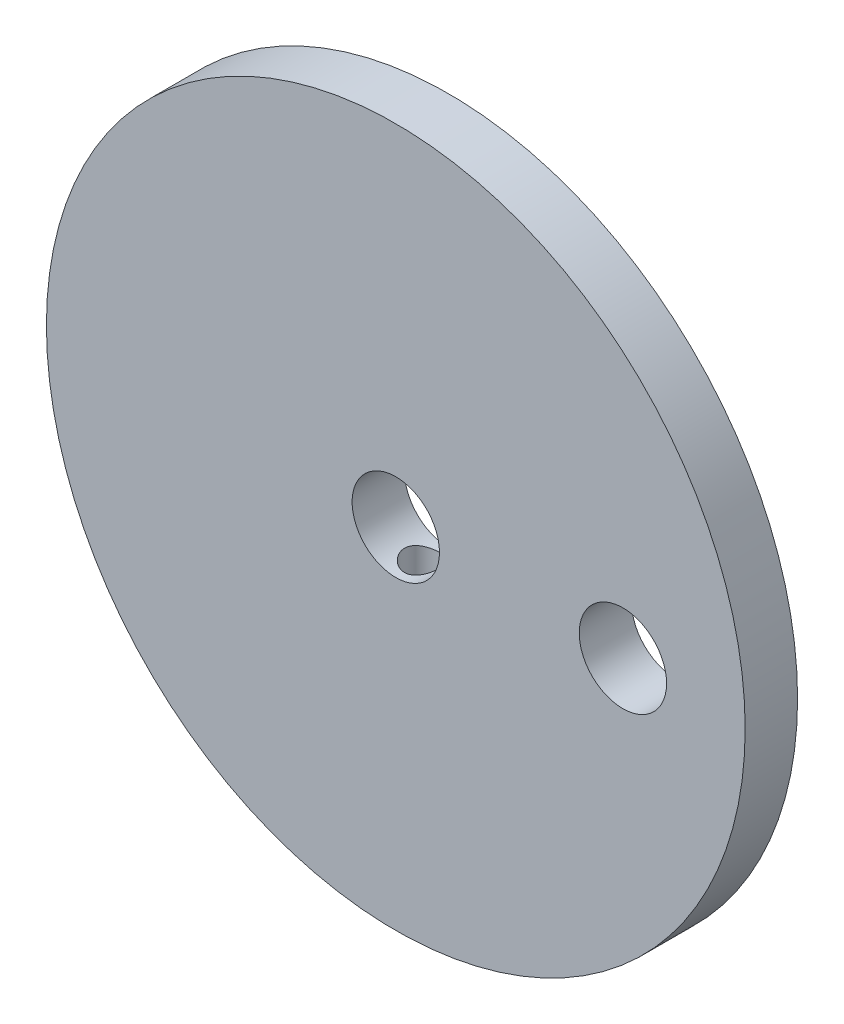
ISO-10303-21;
HEADER;
FILE_DESCRIPTION(('STEP AP214'),'2;1');
FILE_NAME('part.step','',(''),(''),'','','');
FILE_SCHEMA(('AUTOMOTIVE_DESIGN { 1 0 10303 214 1 1 1 1 }'));
ENDSEC;
DATA;
#1=APPLICATION_CONTEXT('core data for automotive mechanical design processes');
#2=APPLICATION_PROTOCOL_DEFINITION('international standard','automotive_design',2000,#1);
#3=PRODUCT_CONTEXT('',#1,'mechanical');
#4=PRODUCT('Part','Part','',(#3));
#5=PRODUCT_RELATED_PRODUCT_CATEGORY('part','',(#4));
#6=PRODUCT_DEFINITION_FORMATION('','',#4);
#7=PRODUCT_DEFINITION_CONTEXT('part definition',#1,'design');
#8=PRODUCT_DEFINITION('design','',#6,#7);
#9=PRODUCT_DEFINITION_SHAPE('','',#8);
#10=(LENGTH_UNIT() NAMED_UNIT(*) SI_UNIT(.MILLI.,.METRE.));
#11=(NAMED_UNIT(*) PLANE_ANGLE_UNIT() SI_UNIT($,.RADIAN.));
#12=(NAMED_UNIT(*) SI_UNIT($,.STERADIAN.) SOLID_ANGLE_UNIT());
#13=UNCERTAINTY_MEASURE_WITH_UNIT(LENGTH_MEASURE(1.E-05),#10,'distance_accuracy_value','');
#14=(GEOMETRIC_REPRESENTATION_CONTEXT(3) GLOBAL_UNCERTAINTY_ASSIGNED_CONTEXT((#13)) GLOBAL_UNIT_ASSIGNED_CONTEXT((#10,
#11,#12)) REPRESENTATION_CONTEXT('',''));
#15=CARTESIAN_POINT('',(0.,0.,0.));
#16=DIRECTION('',(0.,0.,1.));
#17=DIRECTION('',(1.,0.,0.));
#18=AXIS2_PLACEMENT_3D('',#15,#16,#17);
#19=CARTESIAN_POINT('',(0.,0.,3.));
#20=DIRECTION('',(0.,0.,-1.));
#21=DIRECTION('',(-1.,0.,0.));
#22=AXIS2_PLACEMENT_3D('',#19,#20,#21);
#23=CYLINDRICAL_SURFACE('',#22,20.);
#24=CARTESIAN_POINT('',(0.,-20.,0.500000000000003));
#25=CARTESIAN_POINT('',(-0.0561328084555248,-19.9999996655294,0.500002477306929));
#26=CARTESIAN_POINT('',(-0.11230542456669,-19.9997611521284,0.504742212175589));
#27=CARTESIAN_POINT('',(-0.223101053485048,-19.9988326046001,0.52358273680714));
#28=CARTESIAN_POINT('',(-0.277722161339186,-19.9981420384914,0.537694556045654));
#29=CARTESIAN_POINT('',(-0.383793758376999,-19.996387546044,0.574874202773131));
#30=CARTESIAN_POINT('',(-0.435245847944748,-19.9953238100075,0.597937466009447));
#31=CARTESIAN_POINT('',(-0.533534372791899,-19.9929427801102,0.652358306463176));
#32=CARTESIAN_POINT('',(-0.580371894074619,-19.9916255461247,0.683713925707488));
#33=CARTESIAN_POINT('',(-0.668162992872914,-19.9888842135537,0.753864672037542));
#34=CARTESIAN_POINT('',(-0.709111334056615,-19.9874600215585,0.792666349071212));
#35=CARTESIAN_POINT('',(-0.783917078880799,-19.9846660935519,0.876594699003305));
#36=CARTESIAN_POINT('',(-0.817774192857251,-19.9832963597668,0.921721630151483));
#37=CARTESIAN_POINT('',(-0.877450838894596,-19.9807651467349,1.0170469660148));
#38=CARTESIAN_POINT('',(-0.903266282165011,-19.979603773556,1.06724793350112));
#39=CARTESIAN_POINT('',(-0.946100548648126,-19.9776213844645,1.17127828159959));
#40=CARTESIAN_POINT('',(-0.963119438615374,-19.976800365969,1.22510763467343));
#41=CARTESIAN_POINT('',(-0.987863661522063,-19.9755921148363,1.33481857010759));
#42=CARTESIAN_POINT('',(-0.9955968285822,-19.9752045165528,1.39069838146775));
#43=CARTESIAN_POINT('',(-1.00157426036827,-19.9749057166706,1.50296422407006));
#44=CARTESIAN_POINT('',(-0.99981859997612,-19.9749945113122,1.55935025131387));
#45=CARTESIAN_POINT('',(-0.986874740012291,-19.9756381441859,1.67097468289921));
#46=CARTESIAN_POINT('',(-0.975695005165955,-19.9761925641904,1.72621407154766));
#47=CARTESIAN_POINT('',(-0.944233465383965,-19.9777043004764,1.83403111403818));
#48=CARTESIAN_POINT('',(-0.923951621986377,-19.9786616184603,1.88660875663172));
#49=CARTESIAN_POINT('',(-0.874851925522845,-19.9808717346065,1.98763708872913));
#50=CARTESIAN_POINT('',(-0.846030213326568,-19.982124666303,2.03608589965902));
#51=CARTESIAN_POINT('',(-0.780671733875684,-19.9847846560099,2.12746073669428));
#52=CARTESIAN_POINT('',(-0.744134912173972,-19.9861917151079,2.1703867238205));
#53=CARTESIAN_POINT('',(-0.664335591954374,-19.9890032291637,2.24954666994389));
#54=CARTESIAN_POINT('',(-0.621065763185748,-19.9904076795749,2.28577324005812));
#55=CARTESIAN_POINT('',(-0.529054462617553,-19.9930541949019,2.35044907558183));
#56=CARTESIAN_POINT('',(-0.480312989472096,-19.9942962597779,2.37889833907827));
#57=CARTESIAN_POINT('',(-0.378737670176938,-19.9964780758608,2.42721128222313));
#58=CARTESIAN_POINT('',(-0.325903701188691,-19.9974178179889,2.44707470404486));
#59=CARTESIAN_POINT('',(-0.217645070849224,-19.9988889456713,2.47764728429965));
#60=CARTESIAN_POINT('',(-0.162220428895739,-19.9994203342825,2.48835651126342));
#61=CARTESIAN_POINT('',(-0.0504179007209856,-20.0000144735503,2.50030759924858));
#62=CARTESIAN_POINT('',(0.00595889045467789,-20.0000777301058,2.50155968040694));
#63=CARTESIAN_POINT('',(0.118121773767165,-19.999729819291,2.49458760593402));
#64=CARTESIAN_POINT('',(0.173907867856994,-19.9993186534897,2.48636348164352));
#65=CARTESIAN_POINT('',(0.283277155212607,-19.9980685343462,2.46068090805257));
#66=CARTESIAN_POINT('',(0.33686144696345,-19.9972297971909,2.44322712524711));
#67=CARTESIAN_POINT('',(0.440339905498175,-19.9952189657753,2.39958541479388));
#68=CARTESIAN_POINT('',(0.49023405103855,-19.9940468695962,2.3733974368697));
#69=CARTESIAN_POINT('',(0.584962831896552,-19.9914999150917,2.31300455116382));
#70=CARTESIAN_POINT('',(0.629793094810804,-19.9901248838695,2.27879279248131));
#71=CARTESIAN_POINT('',(0.713077580168225,-19.9873274905929,2.20333350115288));
#72=CARTESIAN_POINT('',(0.751531761703046,-19.9859051282349,2.16208592336925));
#73=CARTESIAN_POINT('',(0.8210069181068,-19.9831719452732,2.07368189580644));
#74=CARTESIAN_POINT('',(0.852021280441647,-19.9818612245591,2.02652024584806));
#75=CARTESIAN_POINT('',(0.905691219235939,-19.9795006988305,1.92765309714442));
#76=CARTESIAN_POINT('',(0.928346832073411,-19.9784508926803,1.87594761817552));
#77=CARTESIAN_POINT('',(0.964644632950583,-19.9767312907512,1.76948503830912));
#78=CARTESIAN_POINT('',(0.978291036506768,-19.9760613172647,1.71472937765242));
#79=CARTESIAN_POINT('',(0.996196835140549,-19.9751764313935,1.60370059065799));
#80=CARTESIAN_POINT('',(1.00045628351198,-19.9749615164252,1.54742747293737));
#81=CARTESIAN_POINT('',(0.999466754418516,-19.9750110473025,1.43502698423661));
#82=CARTESIAN_POINT('',(0.994228179690203,-19.9752749687014,1.37889952114586));
#83=CARTESIAN_POINT('',(0.974412811670203,-19.9762513181802,1.26832201134863));
#84=CARTESIAN_POINT('',(0.959836000581312,-19.9769637471149,1.21387196783925));
#85=CARTESIAN_POINT('',(0.921760066011445,-19.978756697424,1.10819275340362));
#86=CARTESIAN_POINT('',(0.898260877051012,-19.9798372214997,1.05696360611807));
#87=CARTESIAN_POINT('',(0.843009039565863,-19.9822445446314,0.959177116602516));
#88=CARTESIAN_POINT('',(0.811256644277891,-19.9835713361306,0.912619631090616));
#89=CARTESIAN_POINT('',(0.740362483652492,-19.9863233106668,0.825446105485375));
#90=CARTESIAN_POINT('',(0.701213467273638,-19.9877485893755,0.78483596561992));
#91=CARTESIAN_POINT('',(0.616642119898202,-19.9905362243773,0.710751640352058));
#92=CARTESIAN_POINT('',(0.571218247965195,-19.9918985651045,0.677279212932302));
#93=CARTESIAN_POINT('',(0.47535095130959,-19.9944077523129,0.618404819688658));
#94=CARTESIAN_POINT('',(0.424902758728777,-19.9955543910642,0.59301061743091));
#95=CARTESIAN_POINT('',(0.320490872538455,-19.9974998604157,0.551083041458472));
#96=CARTESIAN_POINT('',(0.266531416289292,-19.9982991016201,0.534539201745005));
#97=CARTESIAN_POINT('',(0.176863926018213,-19.9992483202059,0.51512145150054));
#98=CARTESIAN_POINT('',(0.141736682808465,-19.9995289613311,0.509458146758656));
#99=CARTESIAN_POINT('',(0.0710782808389619,-19.9999049070539,0.50189663821486));
#100=CARTESIAN_POINT('',(0.0355471224238814,-20.0000002118096,0.499998431200311));
#101=CARTESIAN_POINT('',(0.,-20.,0.500000000000003));
#102=B_SPLINE_CURVE_WITH_KNOTS('',3,(#24,#25,#26,#27,#28,#29,#30,#31,#32,#33,#34,#35,#36,#37,
#38,#39,#40,#41,#42,#43,#44,#45,#46,#47,#48,#49,#50,#51,#52,#53,#54,#55,#56,#57,#58,#59,#60,#61,
#62,#63,#64,#65,#66,#67,#68,#69,#70,#71,#72,#73,#74,#75,#76,#77,#78,#79,#80,#81,#82,#83,#84,#85,
#86,#87,#88,#89,#90,#91,#92,#93,#94,#95,#96,#97,#98,#99,#100,#101),.UNSPECIFIED.,.T.,.F.,(4,2,2,
2,2,2,2,2,2,2,2,2,2,2,2,2,2,2,2,2,2,2,2,2,2,2,2,2,2,2,2,2,2,2,2,2,2,2,4),(0.,0.168268665104246,
0.336735707812515,0.505116963454198,0.673458496721124,0.841948796621361,1.0104459777092,
1.17902869193958,1.34761012682476,1.51604923382161,1.6844870115682,1.85277365912279,
2.0210610177973,2.18942454109828,2.35778925261476,2.52633856273098,2.6948879143062,
2.86344232694609,3.03199547773225,3.2003664506043,3.36873686662238,3.53702223620693,
3.70530857450466,3.87373912629218,4.04217075867272,4.21075154348931,4.37933159461853,
4.54783270911838,4.71633286696151,4.88464858600206,5.05296462582674,5.22128190091137,
5.38959401205288,5.5580719868659,5.72659140915105,5.89527230088847,6.06375327555969,
6.17031256070761,6.27687175493184),.UNSPECIFIED.);
#103=CARTESIAN_POINT('',(0.,-20.,0.500000000000003));
#104=VERTEX_POINT('',#103);
#105=EDGE_CURVE('E70',#104,#104,#102,.T.);
#106=ORIENTED_EDGE('',*,*,#105,.T.);
#107=EDGE_LOOP('',(#106));
#108=FACE_BOUND('',#107,.T.);
#109=CARTESIAN_POINT('',(0.,0.,3.));
#110=DIRECTION('',(0.,0.,1.));
#111=DIRECTION('',(1.,0.,0.));
#112=AXIS2_PLACEMENT_3D('',#109,#110,#111);
#113=CIRCLE('',#112,20.);
#114=CARTESIAN_POINT('',(20.,0.,3.));
#115=VERTEX_POINT('',#114);
#116=EDGE_CURVE('E10',#115,#115,#113,.T.);
#117=ORIENTED_EDGE('',*,*,#116,.F.);
#118=EDGE_LOOP('',(#117));
#119=FACE_BOUND('',#118,.T.);
#120=CARTESIAN_POINT('',(0.,0.,0.));
#121=DIRECTION('',(0.,0.,1.));
#122=DIRECTION('',(1.,0.,0.));
#123=AXIS2_PLACEMENT_3D('',#120,#121,#122);
#124=CIRCLE('',#123,20.);
#125=CARTESIAN_POINT('',(20.,0.,0.));
#126=VERTEX_POINT('',#125);
#127=EDGE_CURVE('E47',#126,#126,#124,.T.);
#128=ORIENTED_EDGE('',*,*,#127,.T.);
#129=EDGE_LOOP('',(#128));
#130=FACE_BOUND('',#129,.T.);
#131=ADVANCED_FACE('F43',(#108,#119,#130),#23,.T.);
#132=CARTESIAN_POINT('',(0.,0.,3.));
#133=DIRECTION('',(0.,0.,1.));
#134=DIRECTION('',(1.,0.,0.));
#135=AXIS2_PLACEMENT_3D('',#132,#133,#134);
#136=PLANE('',#135);
#137=CARTESIAN_POINT('',(13.,0.,3.));
#138=DIRECTION('',(0.,0.,1.));
#139=DIRECTION('',(1.,0.,0.));
#140=AXIS2_PLACEMENT_3D('',#137,#138,#139);
#141=CIRCLE('',#140,2.5);
#142=CARTESIAN_POINT('',(15.5,0.,3.));
#143=VERTEX_POINT('',#142);
#144=EDGE_CURVE('E66',#143,#143,#141,.T.);
#145=ORIENTED_EDGE('',*,*,#144,.F.);
#146=EDGE_LOOP('',(#145));
#147=FACE_BOUND('',#146,.T.);
#148=CARTESIAN_POINT('',(0.,0.,3.));
#149=DIRECTION('',(0.,0.,1.));
#150=DIRECTION('',(1.,0.,0.));
#151=AXIS2_PLACEMENT_3D('',#148,#149,#150);
#152=CIRCLE('',#151,2.5);
#153=CARTESIAN_POINT('',(2.5,0.,3.));
#154=VERTEX_POINT('',#153);
#155=EDGE_CURVE('E58',#154,#154,#152,.T.);
#156=ORIENTED_EDGE('',*,*,#155,.F.);
#157=EDGE_LOOP('',(#156));
#158=FACE_BOUND('',#157,.T.);
#159=ORIENTED_EDGE('',*,*,#116,.T.);
#160=EDGE_LOOP('',(#159));
#161=FACE_BOUND('',#160,.T.);
#162=ADVANCED_FACE('F102',(#147,#158,#161),#136,.T.);
#163=CARTESIAN_POINT('',(0.,0.,0.));
#164=DIRECTION('',(0.,0.,1.));
#165=DIRECTION('',(1.,0.,0.));
#166=AXIS2_PLACEMENT_3D('',#163,#164,#165);
#167=PLANE('',#166);
#168=CARTESIAN_POINT('',(13.,0.,0.));
#169=DIRECTION('',(0.,0.,1.));
#170=DIRECTION('',(1.,0.,0.));
#171=AXIS2_PLACEMENT_3D('',#168,#169,#170);
#172=CIRCLE('',#171,2.5);
#173=CARTESIAN_POINT('',(15.5,0.,0.));
#174=VERTEX_POINT('',#173);
#175=EDGE_CURVE('E62',#174,#174,#172,.T.);
#176=ORIENTED_EDGE('',*,*,#175,.T.);
#177=EDGE_LOOP('',(#176));
#178=FACE_BOUND('',#177,.T.);
#179=CARTESIAN_POINT('',(0.,0.,0.));
#180=DIRECTION('',(0.,0.,1.));
#181=DIRECTION('',(1.,0.,0.));
#182=AXIS2_PLACEMENT_3D('',#179,#180,#181);
#183=CIRCLE('',#182,2.5);
#184=CARTESIAN_POINT('',(2.5,0.,0.));
#185=VERTEX_POINT('',#184);
#186=EDGE_CURVE('E56',#185,#185,#183,.T.);
#187=ORIENTED_EDGE('',*,*,#186,.T.);
#188=EDGE_LOOP('',(#187));
#189=FACE_BOUND('',#188,.T.);
#190=ORIENTED_EDGE('',*,*,#127,.F.);
#191=EDGE_LOOP('',(#190));
#192=FACE_BOUND('',#191,.T.);
#193=ADVANCED_FACE('F100',(#178,#189,#192),#167,.F.);
#194=CARTESIAN_POINT('',(0.,0.,0.));
#195=DIRECTION('',(0.,0.,1.));
#196=DIRECTION('',(1.,0.,0.));
#197=AXIS2_PLACEMENT_3D('',#194,#195,#196);
#198=CYLINDRICAL_SURFACE('',#197,2.5);
#199=CARTESIAN_POINT('',(0.,-2.5,0.500000000000003));
#200=CARTESIAN_POINT('',(0.0537465027214455,-2.49999635613542,0.500004925911865));
#201=CARTESIAN_POINT('',(0.107586282045336,-2.49824647153466,0.50435887604419));
#202=CARTESIAN_POINT('',(0.213748240208947,-2.49141726550321,0.521623851760621));
#203=CARTESIAN_POINT('',(0.266065888780623,-2.48632889349439,0.534558139543069));
#204=CARTESIAN_POINT('',(0.367476961363701,-2.47337104606559,0.568438039029418));
#205=CARTESIAN_POINT('',(0.416580330808478,-2.46551068182036,0.589357423108368));
#206=CARTESIAN_POINT('',(0.510535985164182,-2.44778305398039,0.638509586663275));
#207=CARTESIAN_POINT('',(0.555389738375495,-2.43791648729028,0.666739827459467));
#208=CARTESIAN_POINT('',(0.641750503785195,-2.41665443085209,0.731117749280471));
#209=CARTESIAN_POINT('',(0.683031136275105,-2.40521148464595,0.767553328120134));
#210=CARTESIAN_POINT('',(0.759087502392359,-2.38230288453097,0.846700001738391));
#211=CARTESIAN_POINT('',(0.793860053566764,-2.37083722226896,0.889414148605873));
#212=CARTESIAN_POINT('',(0.857437283646437,-2.34861395898568,0.982214035121135));
#213=CARTESIAN_POINT('',(0.885907490597734,-2.33791057982476,1.0325432430116));
#214=CARTESIAN_POINT('',(0.933877359518572,-2.31916823593396,1.13776819921002));
#215=CARTESIAN_POINT('',(0.953381282142915,-2.31112800622088,1.19266176392418));
#216=CARTESIAN_POINT('',(0.981949411697931,-2.29913178830409,1.30285616679605));
#217=CARTESIAN_POINT('',(0.991446982902821,-2.29500710177803,1.35802561778811));
#218=CARTESIAN_POINT('',(1.00108648082001,-2.29082002024572,1.46931749915363));
#219=CARTESIAN_POINT('',(1.00123300815661,-2.29075562761384,1.52543944731251));
#220=CARTESIAN_POINT('',(0.992494683752269,-2.29455250139997,1.63287833572902));
#221=CARTESIAN_POINT('',(0.984237657152566,-2.29814087519225,1.68425785720452));
#222=CARTESIAN_POINT('',(0.959973440148907,-2.30838093803918,1.78482977800336));
#223=CARTESIAN_POINT('',(0.943964897402313,-2.31503316160837,1.83402179405515));
#224=CARTESIAN_POINT('',(0.904347366275534,-2.33079742544265,1.93000891809802));
#225=CARTESIAN_POINT('',(0.880589931157656,-2.33995689640394,1.97673461952734));
#226=CARTESIAN_POINT('',(0.826253230366104,-2.35969058194945,2.06570790818078));
#227=CARTESIAN_POINT('',(0.795671402550419,-2.37026532728424,2.1079538047014));
#228=CARTESIAN_POINT('',(0.725775299727214,-2.39263368371135,2.190204864401));
#229=CARTESIAN_POINT('',(0.685968731485315,-2.40445832488076,2.22978436472301));
#230=CARTESIAN_POINT('',(0.600157213715094,-2.42729912479141,2.30184223900102));
#231=CARTESIAN_POINT('',(0.554151032667215,-2.43831512222662,2.33431919870514));
#232=CARTESIAN_POINT('',(0.45603882630292,-2.45857340632274,2.39180872370791));
#233=CARTESIAN_POINT('',(0.403830245673237,-2.46777635047707,2.41666114059852));
#234=CARTESIAN_POINT('',(0.29551188274144,-2.48307414164379,2.45708393053903));
#235=CARTESIAN_POINT('',(0.239404098424836,-2.48917056731191,2.4726590187787));
#236=CARTESIAN_POINT('',(0.12844794380391,-2.49728069753455,2.49322414770985));
#237=CARTESIAN_POINT('',(0.0737216469927669,-2.49951472916757,2.49878622712678));
#238=CARTESIAN_POINT('',(-0.0359226549039088,-2.50034239255315,2.5008565502643));
#239=CARTESIAN_POINT('',(-0.0908406066119618,-2.49893696791146,2.49736714077375));
#240=CARTESIAN_POINT('',(-0.196716369560993,-2.49278783531876,2.481854123724));
#241=CARTESIAN_POINT('',(-0.247741245887737,-2.48819695672762,2.47022100982451));
#242=CARTESIAN_POINT('',(-0.347067714030389,-2.4762972070275,2.43928214584509));
#243=CARTESIAN_POINT('',(-0.395368955112421,-2.46898798678265,2.41997541016566));
#244=CARTESIAN_POINT('',(-0.48953939290835,-2.45208297385406,2.37360753016002));
#245=CARTESIAN_POINT('',(-0.535289011377702,-2.44242407989902,2.34632726397842));
#246=CARTESIAN_POINT('',(-0.621721795623276,-2.42186682372762,2.28502983804718));
#247=CARTESIAN_POINT('',(-0.662402920380561,-2.41096796555135,2.25100997853869));
#248=CARTESIAN_POINT('',(-0.740361521514408,-2.38822558819056,2.17456499352518));
#249=CARTESIAN_POINT('',(-0.77723696690303,-2.37636720712526,2.13173322924689));
#250=CARTESIAN_POINT('',(-0.843375598706853,-2.35370836458566,2.04027995849531));
#251=CARTESIAN_POINT('',(-0.872637530668752,-2.34290807763255,1.99165749983002));
#252=CARTESIAN_POINT('',(-0.922903750965812,-2.32357149953854,1.88926915270295));
#253=CARTESIAN_POINT('',(-0.943825297267225,-2.31505815442394,1.83545800039384));
#254=CARTESIAN_POINT('',(-0.97614810985265,-2.30161836738966,1.72463317414242));
#255=CARTESIAN_POINT('',(-0.987556402634655,-2.29668927847999,1.66762189709379));
#256=CARTESIAN_POINT('',(-0.999857808639198,-2.29135879649963,1.55643604911273));
#257=CARTESIAN_POINT('',(-1.00144854115143,-2.29065710504086,1.50235258020332));
#258=CARTESIAN_POINT('',(-0.995901579638759,-2.29307418016549,1.39472757114335));
#259=CARTESIAN_POINT('',(-0.988764993956888,-2.29619246162397,1.34118596304871));
#260=CARTESIAN_POINT('',(-0.966535683076821,-2.3056332453951,1.23833390507248));
#261=CARTESIAN_POINT('',(-0.951768746785486,-2.31182415913725,1.1889398627835));
#262=CARTESIAN_POINT('',(-0.915002724245504,-2.32662000616348,1.09331068519326));
#263=CARTESIAN_POINT('',(-0.893001640696904,-2.33522560603003,1.04707642655009));
#264=CARTESIAN_POINT('',(-0.840936381379863,-2.35449304802246,0.956195190364612));
#265=CARTESIAN_POINT('',(-0.810482667579742,-2.36524441156621,0.911790664934759));
#266=CARTESIAN_POINT('',(-0.742946059635746,-2.38731902186119,0.828503341398124));
#267=CARTESIAN_POINT('',(-0.705861167409058,-2.39864244024203,0.789622213935844));
#268=CARTESIAN_POINT('',(-0.623252753136229,-2.42146783543697,0.715898573368194));
#269=CARTESIAN_POINT('',(-0.577338000573067,-2.43293378981093,0.681481346550968));
#270=CARTESIAN_POINT('',(-0.479950160142888,-2.45400203356858,0.620831478689184));
#271=CARTESIAN_POINT('',(-0.428474502273617,-2.46360345546453,0.594602643923738));
#272=CARTESIAN_POINT('',(-0.3223690312476,-2.47969857407931,0.551688892404858));
#273=CARTESIAN_POINT('',(-0.267815809109847,-2.48624681527514,0.534835338219833));
#274=CARTESIAN_POINT('',(-0.156438273140609,-2.49572153104683,0.510680439522869));
#275=CARTESIAN_POINT('',(-0.0996217629294552,-2.49865949747819,0.503348781628053));
#276=CARTESIAN_POINT('',(-0.0284561489454642,-2.49987949752068,0.500302309510866));
#277=CARTESIAN_POINT('',(-0.0142313443703789,-2.50000096484588,0.499998695685405));
#278=CARTESIAN_POINT('',(0.,-2.5,0.500000000000003));
#279=B_SPLINE_CURVE_WITH_KNOTS('',3,(#199,#200,#201,#202,#203,#204,#205,#206,#207,#208,#209,
#210,#211,#212,#213,#214,#215,#216,#217,#218,#219,#220,#221,#222,#223,#224,#225,#226,#227,#228,
#229,#230,#231,#232,#233,#234,#235,#236,#237,#238,#239,#240,#241,#242,#243,#244,#245,#246,#247,
#248,#249,#250,#251,#252,#253,#254,#255,#256,#257,#258,#259,#260,#261,#262,#263,#264,#265,#266,
#267,#268,#269,#270,#271,#272,#273,#274,#275,#276,#277,#278),.UNSPECIFIED.,.T.,.F.,(4,2,2,2,2,2,
2,2,2,2,2,2,2,2,2,2,2,2,2,2,2,2,2,2,2,2,2,2,2,2,2,2,2,2,2,2,2,2,2,4),(0.,0.161201493946535,
0.322841818003966,0.483955728735789,0.645013767839919,0.812986908501983,0.981041974672055,
1.15657629409608,1.33202711559134,1.49952052654414,1.66693153170244,1.82269164200686,
1.97847893628023,2.13744563149407,2.29647210969091,2.46779174593278,2.63914546419866,
2.81388456581402,2.98853478056894,3.15284592264003,3.3171144678504,3.47400227782182,
3.63091024496897,3.7926175669913,3.95438979749483,4.12684237312206,4.29932334521873,
4.47347522570413,4.64749836322966,4.80899836696373,4.97047786281521,5.12557159274383,
5.28070817902579,5.44472734028345,5.60879600674195,5.78350211766916,5.95828931820265,
6.12982150506658,6.30080626202169,6.34349022948396),.UNSPECIFIED.);
#280=CARTESIAN_POINT('',(0.,-2.5,0.500000000000003));
#281=VERTEX_POINT('',#280);
#282=EDGE_CURVE('E81',#281,#281,#279,.T.);
#283=ORIENTED_EDGE('',*,*,#282,.T.);
#284=EDGE_LOOP('',(#283));
#285=FACE_BOUND('',#284,.T.);
#286=ORIENTED_EDGE('',*,*,#186,.F.);
#287=EDGE_LOOP('',(#286));
#288=FACE_BOUND('',#287,.T.);
#289=ORIENTED_EDGE('',*,*,#155,.T.);
#290=EDGE_LOOP('',(#289));
#291=FACE_BOUND('',#290,.T.);
#292=ADVANCED_FACE('F96',(#285,#288,#291),#198,.F.);
#293=CARTESIAN_POINT('',(13.,0.,0.));
#294=DIRECTION('',(0.,0.,1.));
#295=DIRECTION('',(1.,0.,0.));
#296=AXIS2_PLACEMENT_3D('',#293,#294,#295);
#297=CYLINDRICAL_SURFACE('',#296,2.5);
#298=ORIENTED_EDGE('',*,*,#175,.F.);
#299=EDGE_LOOP('',(#298));
#300=FACE_BOUND('',#299,.T.);
#301=ORIENTED_EDGE('',*,*,#144,.T.);
#302=EDGE_LOOP('',(#301));
#303=FACE_BOUND('',#302,.T.);
#304=ADVANCED_FACE('F89',(#300,#303),#297,.F.);
#305=CARTESIAN_POINT('',(0.,-20.,1.5));
#306=DIRECTION('',(0.,-1.,0.));
#307=DIRECTION('',(0.,0.,-1.));
#308=AXIS2_PLACEMENT_3D('',#305,#306,#307);
#309=CYLINDRICAL_SURFACE('',#308,0.999999999999997);
#310=ORIENTED_EDGE('',*,*,#282,.F.);
#311=EDGE_LOOP('',(#310));
#312=FACE_BOUND('',#311,.T.);
#313=ORIENTED_EDGE('',*,*,#105,.F.);
#314=EDGE_LOOP('',(#313));
#315=FACE_BOUND('',#314,.T.);
#316=ADVANCED_FACE('F86',(#312,#315),#309,.F.);
#317=CLOSED_SHELL('',(#131,#162,#193,#292,#304,#316));
#318=MANIFOLD_SOLID_BREP('B2',#317);
#319=ADVANCED_BREP_SHAPE_REPRESENTATION('',(#18,#318),#14);
#320=SHAPE_DEFINITION_REPRESENTATION(#9,#319);
ENDSEC;
END-ISO-10303-21;
